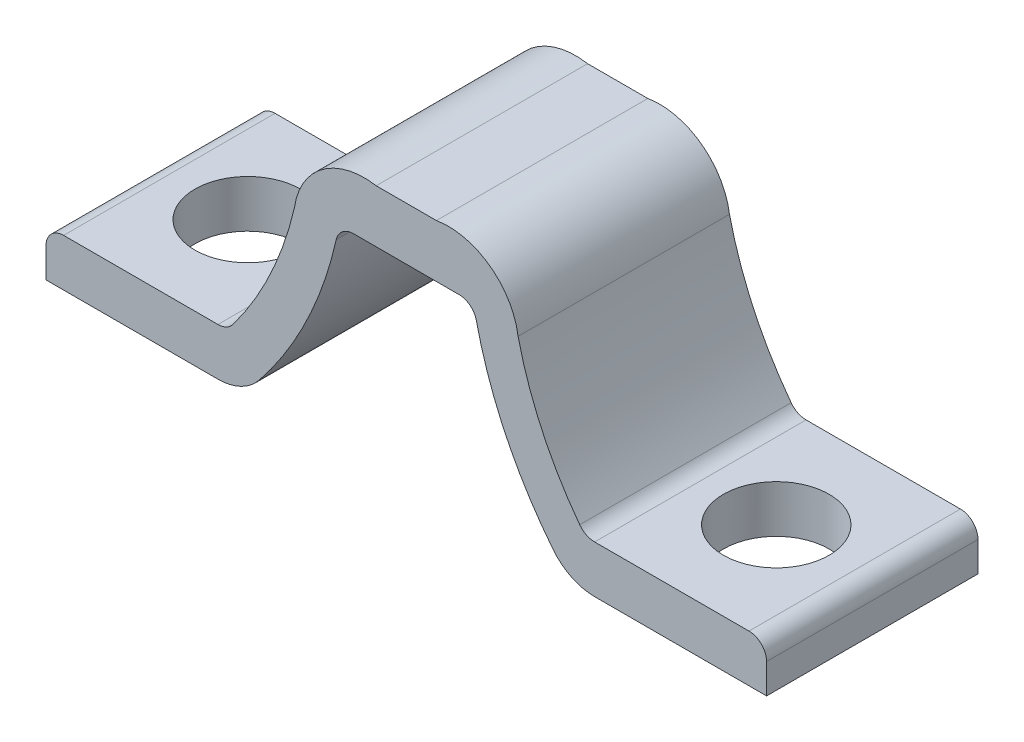
ISO-10303-21;
HEADER;
FILE_DESCRIPTION(('STEP AP214'),'2;1');
FILE_NAME('part.step','',(''),(''),'','','');
FILE_SCHEMA(('AUTOMOTIVE_DESIGN { 1 0 10303 214 1 1 1 1 }'));
ENDSEC;
DATA;
#1=APPLICATION_CONTEXT('core data for automotive mechanical design processes');
#2=APPLICATION_PROTOCOL_DEFINITION('international standard','automotive_design',2000,#1);
#3=PRODUCT_CONTEXT('',#1,'mechanical');
#4=PRODUCT('Part','Part','',(#3));
#5=PRODUCT_RELATED_PRODUCT_CATEGORY('part','',(#4));
#6=PRODUCT_DEFINITION_FORMATION('','',#4);
#7=PRODUCT_DEFINITION_CONTEXT('part definition',#1,'design');
#8=PRODUCT_DEFINITION('design','',#6,#7);
#9=PRODUCT_DEFINITION_SHAPE('','',#8);
#10=(LENGTH_UNIT() NAMED_UNIT(*) SI_UNIT(.MILLI.,.METRE.));
#11=(NAMED_UNIT(*) PLANE_ANGLE_UNIT() SI_UNIT($,.RADIAN.));
#12=(NAMED_UNIT(*) SI_UNIT($,.STERADIAN.) SOLID_ANGLE_UNIT());
#13=UNCERTAINTY_MEASURE_WITH_UNIT(LENGTH_MEASURE(1.E-05),#10,'distance_accuracy_value','');
#14=(GEOMETRIC_REPRESENTATION_CONTEXT(3) GLOBAL_UNCERTAINTY_ASSIGNED_CONTEXT((#13)) GLOBAL_UNIT_ASSIGNED_CONTEXT((#10,
#11,#12)) REPRESENTATION_CONTEXT('',''));
#15=CARTESIAN_POINT('',(0.,0.,0.));
#16=DIRECTION('',(0.,0.,1.));
#17=DIRECTION('',(1.,0.,0.));
#18=AXIS2_PLACEMENT_3D('',#15,#16,#17);
#19=CARTESIAN_POINT('',(6.78866498730215,2.38113734804587,7.62));
#20=DIRECTION('',(0.,0.,-1.));
#21=DIRECTION('',(-1.,0.,0.));
#22=AXIS2_PLACEMENT_3D('',#19,#20,#21);
#23=CYLINDRICAL_SURFACE('',#22,0.67297468040052);
#24=CARTESIAN_POINT('',(6.78866498730215,2.38113734804587,0.));
#25=DIRECTION('',(0.,0.,1.));
#26=DIRECTION('',(1.,0.,0.));
#27=AXIS2_PLACEMENT_3D('',#24,#25,#26);
#28=CIRCLE('',#27,0.67297468040052);
#29=CARTESIAN_POINT('',(6.78866498730215,1.70816266764535,0.));
#30=VERTEX_POINT('',#29);
#31=CARTESIAN_POINT('',(6.25072189397713,1.97677099335735,0.));
#32=VERTEX_POINT('',#31);
#33=EDGE_CURVE('E216',#30,#32,#28,.F.);
#34=ORIENTED_EDGE('',*,*,#33,.T.);
#35=DIRECTION('',(0.,0.,-1.));
#36=VECTOR('',#35,1.);
#37=CARTESIAN_POINT('',(6.25072189397713,1.97677099335735,7.62));
#38=LINE('',#37,#36);
#39=CARTESIAN_POINT('',(6.25072189397713,1.97677099335735,7.62));
#40=VERTEX_POINT('',#39);
#41=EDGE_CURVE('E11',#40,#32,#38,.T.);
#42=ORIENTED_EDGE('',*,*,#41,.F.);
#43=CARTESIAN_POINT('',(6.78866498730215,2.38113734804587,7.62));
#44=DIRECTION('',(0.,0.,1.));
#45=DIRECTION('',(1.,0.,0.));
#46=AXIS2_PLACEMENT_3D('',#43,#44,#45);
#47=CIRCLE('',#46,0.67297468040052);
#48=CARTESIAN_POINT('',(6.78866498730215,1.70816266764535,7.62));
#49=VERTEX_POINT('',#48);
#50=EDGE_CURVE('E274',#49,#40,#47,.F.);
#51=ORIENTED_EDGE('',*,*,#50,.F.);
#52=DIRECTION('',(0.,0.,-1.));
#53=VECTOR('',#52,1.);
#54=CARTESIAN_POINT('',(6.78866498730215,1.70816266764535,7.62));
#55=LINE('',#54,#53);
#56=EDGE_CURVE('E212',#49,#30,#55,.T.);
#57=ORIENTED_EDGE('',*,*,#56,.T.);
#58=EDGE_LOOP('',(#34,#42,#51,#57));
#59=FACE_BOUND('',#58,.T.);
#60=ADVANCED_FACE('F35',(#59),#23,.F.);
#61=CARTESIAN_POINT('',(16.4024816617619,9.60774561113634,7.62));
#62=DIRECTION('',(0.,0.,-1.));
#63=DIRECTION('',(-1.,0.,0.));
#64=AXIS2_PLACEMENT_3D('',#61,#62,#63);
#65=CYLINDRICAL_SURFACE('',#64,12.7);
#66=CARTESIAN_POINT('',(16.4024816617619,9.60774561113634,0.));
#67=DIRECTION('',(0.,0.,1.));
#68=DIRECTION('',(1.,0.,0.));
#69=AXIS2_PLACEMENT_3D('',#66,#67,#68);
#70=CIRCLE('',#69,12.7);
#71=CARTESIAN_POINT('',(4.02932646457833,6.74504924819284,0.));
#72=VERTEX_POINT('',#71);
#73=EDGE_CURVE('E219',#32,#72,#70,.F.);
#74=ORIENTED_EDGE('',*,*,#73,.T.);
#75=DIRECTION('',(0.,0.,-1.));
#76=VECTOR('',#75,1.);
#77=CARTESIAN_POINT('',(4.02932646457833,6.74504924819284,7.62));
#78=LINE('',#77,#76);
#79=CARTESIAN_POINT('',(4.02932646457833,6.74504924819284,7.62));
#80=VERTEX_POINT('',#79);
#81=EDGE_CURVE('E44',#80,#72,#78,.T.);
#82=ORIENTED_EDGE('',*,*,#81,.F.);
#83=CARTESIAN_POINT('',(16.4024816617619,9.60774561113634,7.62));
#84=DIRECTION('',(0.,0.,1.));
#85=DIRECTION('',(1.,0.,0.));
#86=AXIS2_PLACEMENT_3D('',#83,#84,#85);
#87=CIRCLE('',#86,12.7);
#88=EDGE_CURVE('E137',#40,#80,#87,.F.);
#89=ORIENTED_EDGE('',*,*,#88,.F.);
#90=ORIENTED_EDGE('',*,*,#41,.T.);
#91=EDGE_LOOP('',(#74,#82,#89,#90));
#92=FACE_BOUND('',#91,.T.);
#93=ADVANCED_FACE('F318',(#92),#65,.F.);
#94=CARTESIAN_POINT('',(1.5147536769133,6.38654723211135,7.62));
#95=DIRECTION('',(0.,0.,-1.));
#96=DIRECTION('',(-1.,0.,0.));
#97=AXIS2_PLACEMENT_3D('',#94,#95,#96);
#98=CYLINDRICAL_SURFACE('',#97,2.54);
#99=CARTESIAN_POINT('',(1.5147536769133,6.38654723211135,0.));
#100=DIRECTION('',(0.,0.,1.));
#101=DIRECTION('',(1.,0.,0.));
#102=AXIS2_PLACEMENT_3D('',#99,#100,#101);
#103=CIRCLE('',#102,2.54);
#104=CARTESIAN_POINT('',(1.08542368850035,8.89,0.));
#105=VERTEX_POINT('',#104);
#106=EDGE_CURVE('E222',#105,#72,#103,.F.);
#107=ORIENTED_EDGE('',*,*,#106,.F.);
#108=DIRECTION('',(0.,0.,-1.));
#109=VECTOR('',#108,1.);
#110=CARTESIAN_POINT('',(1.08542368850035,8.89,7.62));
#111=LINE('',#110,#109);
#112=CARTESIAN_POINT('',(1.08542368850035,8.89,7.62));
#113=VERTEX_POINT('',#112);
#114=EDGE_CURVE('E310',#113,#105,#111,.T.);
#115=ORIENTED_EDGE('',*,*,#114,.F.);
#116=CARTESIAN_POINT('',(1.5147536769133,6.38654723211135,7.62));
#117=DIRECTION('',(0.,0.,1.));
#118=DIRECTION('',(1.,0.,0.));
#119=AXIS2_PLACEMENT_3D('',#116,#117,#118);
#120=CIRCLE('',#119,2.54);
#121=EDGE_CURVE('E317',#113,#80,#120,.F.);
#122=ORIENTED_EDGE('',*,*,#121,.T.);
#123=ORIENTED_EDGE('',*,*,#81,.T.);
#124=EDGE_LOOP('',(#107,#115,#122,#123));
#125=FACE_BOUND('',#124,.T.);
#126=ADVANCED_FACE('F315',(#125),#98,.T.);
#127=CARTESIAN_POINT('',(0.,8.89,7.62));
#128=DIRECTION('',(0.,1.,0.));
#129=DIRECTION('',(0.,0.,1.));
#130=AXIS2_PLACEMENT_3D('',#127,#128,#129);
#131=PLANE('',#130);
#132=DIRECTION('',(1.,0.,0.));
#133=VECTOR('',#132,1.);
#134=CARTESIAN_POINT('',(0.,8.89,0.));
#135=LINE('',#134,#133);
#136=CARTESIAN_POINT('',(-1.08542368850035,8.89,0.));
#137=VERTEX_POINT('',#136);
#138=EDGE_CURVE('E225',#137,#105,#135,.T.);
#139=ORIENTED_EDGE('',*,*,#138,.F.);
#140=DIRECTION('',(0.,0.,-1.));
#141=VECTOR('',#140,1.);
#142=CARTESIAN_POINT('',(-1.08542368850035,8.89,7.62));
#143=LINE('',#142,#141);
#144=CARTESIAN_POINT('',(-1.08542368850035,8.89,7.62));
#145=VERTEX_POINT('',#144);
#146=EDGE_CURVE('E308',#145,#137,#143,.T.);
#147=ORIENTED_EDGE('',*,*,#146,.F.);
#148=DIRECTION('',(1.,0.,0.));
#149=VECTOR('',#148,1.);
#150=CARTESIAN_POINT('',(0.,8.89,7.62));
#151=LINE('',#150,#149);
#152=EDGE_CURVE('E330',#145,#113,#151,.T.);
#153=ORIENTED_EDGE('',*,*,#152,.T.);
#154=ORIENTED_EDGE('',*,*,#114,.T.);
#155=EDGE_LOOP('',(#139,#147,#153,#154));
#156=FACE_BOUND('',#155,.T.);
#157=ADVANCED_FACE('F326',(#156),#131,.T.);
#158=CARTESIAN_POINT('',(-1.5147536769133,6.38654723211135,7.62));
#159=DIRECTION('',(0.,0.,-1.));
#160=DIRECTION('',(-1.,0.,0.));
#161=AXIS2_PLACEMENT_3D('',#158,#159,#160);
#162=CYLINDRICAL_SURFACE('',#161,2.54);
#163=CARTESIAN_POINT('',(-1.5147536769133,6.38654723211135,0.));
#164=DIRECTION('',(0.,0.,1.));
#165=DIRECTION('',(1.,0.,0.));
#166=AXIS2_PLACEMENT_3D('',#163,#164,#165);
#167=CIRCLE('',#166,2.54);
#168=CARTESIAN_POINT('',(-4.02932646457833,6.74504924819284,0.));
#169=VERTEX_POINT('',#168);
#170=EDGE_CURVE('E228',#137,#169,#167,.T.);
#171=ORIENTED_EDGE('',*,*,#170,.T.);
#172=DIRECTION('',(0.,0.,-1.));
#173=VECTOR('',#172,1.);
#174=CARTESIAN_POINT('',(-4.02932646457833,6.74504924819284,7.62));
#175=LINE('',#174,#173);
#176=CARTESIAN_POINT('',(-4.02932646457833,6.74504924819284,7.62));
#177=VERTEX_POINT('',#176);
#178=EDGE_CURVE('E306',#177,#169,#175,.T.);
#179=ORIENTED_EDGE('',*,*,#178,.F.);
#180=CARTESIAN_POINT('',(-1.5147536769133,6.38654723211135,7.62));
#181=DIRECTION('',(0.,0.,1.));
#182=DIRECTION('',(1.,0.,0.));
#183=AXIS2_PLACEMENT_3D('',#180,#181,#182);
#184=CIRCLE('',#183,2.54);
#185=EDGE_CURVE('E332',#145,#177,#184,.T.);
#186=ORIENTED_EDGE('',*,*,#185,.F.);
#187=ORIENTED_EDGE('',*,*,#146,.T.);
#188=EDGE_LOOP('',(#171,#179,#186,#187));
#189=FACE_BOUND('',#188,.T.);
#190=ADVANCED_FACE('F401',(#189),#162,.T.);
#191=CARTESIAN_POINT('',(-16.4024816617619,9.60774561113634,7.62));
#192=DIRECTION('',(0.,0.,-1.));
#193=DIRECTION('',(-1.,0.,0.));
#194=AXIS2_PLACEMENT_3D('',#191,#192,#193);
#195=CYLINDRICAL_SURFACE('',#194,12.7);
#196=CARTESIAN_POINT('',(-16.4024816617619,9.60774561113634,0.));
#197=DIRECTION('',(0.,0.,1.));
#198=DIRECTION('',(1.,0.,0.));
#199=AXIS2_PLACEMENT_3D('',#196,#197,#198);
#200=CIRCLE('',#199,12.7);
#201=CARTESIAN_POINT('',(-6.25072189397713,1.97677099335735,0.));
#202=VERTEX_POINT('',#201);
#203=EDGE_CURVE('E231',#202,#169,#200,.T.);
#204=ORIENTED_EDGE('',*,*,#203,.F.);
#205=DIRECTION('',(0.,0.,-1.));
#206=VECTOR('',#205,1.);
#207=CARTESIAN_POINT('',(-6.25072189397713,1.97677099335735,7.62));
#208=LINE('',#207,#206);
#209=CARTESIAN_POINT('',(-6.25072189397713,1.97677099335735,7.62));
#210=VERTEX_POINT('',#209);
#211=EDGE_CURVE('E304',#210,#202,#208,.T.);
#212=ORIENTED_EDGE('',*,*,#211,.F.);
#213=CARTESIAN_POINT('',(-16.4024816617619,9.60774561113634,7.62));
#214=DIRECTION('',(0.,0.,1.));
#215=DIRECTION('',(1.,0.,0.));
#216=AXIS2_PLACEMENT_3D('',#213,#214,#215);
#217=CIRCLE('',#216,12.7);
#218=EDGE_CURVE('E338',#210,#177,#217,.T.);
#219=ORIENTED_EDGE('',*,*,#218,.T.);
#220=ORIENTED_EDGE('',*,*,#178,.T.);
#221=EDGE_LOOP('',(#204,#212,#219,#220));
#222=FACE_BOUND('',#221,.T.);
#223=ADVANCED_FACE('F404',(#222),#195,.F.);
#224=CARTESIAN_POINT('',(-6.78866498730215,2.38113734804587,7.62));
#225=DIRECTION('',(0.,0.,-1.));
#226=DIRECTION('',(-1.,0.,0.));
#227=AXIS2_PLACEMENT_3D('',#224,#225,#226);
#228=CYLINDRICAL_SURFACE('',#227,0.67297468040052);
#229=CARTESIAN_POINT('',(-6.78866498730215,2.38113734804587,0.));
#230=DIRECTION('',(0.,0.,1.));
#231=DIRECTION('',(1.,0.,0.));
#232=AXIS2_PLACEMENT_3D('',#229,#230,#231);
#233=CIRCLE('',#232,0.67297468040052);
#234=CARTESIAN_POINT('',(-6.78866498730215,1.70816266764535,0.));
#235=VERTEX_POINT('',#234);
#236=EDGE_CURVE('E234',#235,#202,#233,.T.);
#237=ORIENTED_EDGE('',*,*,#236,.F.);
#238=DIRECTION('',(0.,0.,-1.));
#239=VECTOR('',#238,1.);
#240=CARTESIAN_POINT('',(-6.78866498730215,1.70816266764535,7.62));
#241=LINE('',#240,#239);
#242=CARTESIAN_POINT('',(-6.78866498730215,1.70816266764535,7.62));
#243=VERTEX_POINT('',#242);
#244=EDGE_CURVE('E302',#243,#235,#241,.T.);
#245=ORIENTED_EDGE('',*,*,#244,.F.);
#246=CARTESIAN_POINT('',(-6.78866498730215,2.38113734804587,7.62));
#247=DIRECTION('',(0.,0.,1.));
#248=DIRECTION('',(1.,0.,0.));
#249=AXIS2_PLACEMENT_3D('',#246,#247,#248);
#250=CIRCLE('',#249,0.67297468040052);
#251=EDGE_CURVE('E341',#243,#210,#250,.T.);
#252=ORIENTED_EDGE('',*,*,#251,.T.);
#253=ORIENTED_EDGE('',*,*,#211,.T.);
#254=EDGE_LOOP('',(#237,#245,#252,#253));
#255=FACE_BOUND('',#254,.T.);
#256=ADVANCED_FACE('F408',(#255),#228,.F.);
#257=CARTESIAN_POINT('',(0.,1.70816266764535,7.62));
#258=DIRECTION('',(0.,1.,0.));
#259=DIRECTION('',(0.,0.,1.));
#260=AXIS2_PLACEMENT_3D('',#257,#258,#259);
#261=PLANE('',#260);
#262=CARTESIAN_POINT('',(-9.525,1.70816266764535,3.81));
#263=DIRECTION('',(0.,1.,0.));
#264=DIRECTION('',(0.,0.,1.));
#265=AXIS2_PLACEMENT_3D('',#262,#263,#264);
#266=CIRCLE('',#265,1.905);
#267=CARTESIAN_POINT('',(-9.525,1.70816266764535,5.715));
#268=VERTEX_POINT('',#267);
#269=EDGE_CURVE('E539',#268,#268,#266,.T.);
#270=ORIENTED_EDGE('',*,*,#269,.F.);
#271=EDGE_LOOP('',(#270));
#272=FACE_BOUND('',#271,.T.);
#273=DIRECTION('',(1.,0.,0.));
#274=VECTOR('',#273,1.);
#275=CARTESIAN_POINT('',(0.,1.70816266764535,0.));
#276=LINE('',#275,#274);
#277=CARTESIAN_POINT('',(-12.3509367165086,1.70816266764535,0.));
#278=VERTEX_POINT('',#277);
#279=EDGE_CURVE('E237',#278,#235,#276,.T.);
#280=ORIENTED_EDGE('',*,*,#279,.F.);
#281=DIRECTION('',(0.,0.,-1.));
#282=VECTOR('',#281,1.);
#283=CARTESIAN_POINT('',(-12.3509367165086,1.70816266764535,7.62));
#284=LINE('',#283,#282);
#285=CARTESIAN_POINT('',(-12.3509367165086,1.70816266764535,7.62));
#286=VERTEX_POINT('',#285);
#287=EDGE_CURVE('E300',#286,#278,#284,.T.);
#288=ORIENTED_EDGE('',*,*,#287,.F.);
#289=DIRECTION('',(1.,0.,0.));
#290=VECTOR('',#289,1.);
#291=CARTESIAN_POINT('',(0.,1.70816266764535,7.62));
#292=LINE('',#291,#290);
#293=EDGE_CURVE('E344',#286,#243,#292,.T.);
#294=ORIENTED_EDGE('',*,*,#293,.T.);
#295=ORIENTED_EDGE('',*,*,#244,.T.);
#296=EDGE_LOOP('',(#280,#288,#294,#295));
#297=FACE_BOUND('',#296,.T.);
#298=ADVANCED_FACE('F412',(#272,#297),#261,.T.);
#299=CARTESIAN_POINT('',(-12.3509367165086,1.07316266764535,7.62));
#300=DIRECTION('',(0.,0.,-1.));
#301=DIRECTION('',(-1.,0.,0.));
#302=AXIS2_PLACEMENT_3D('',#299,#300,#301);
#303=CYLINDRICAL_SURFACE('',#302,0.635);
#304=CARTESIAN_POINT('',(-12.3509367165086,1.07316266764535,0.));
#305=DIRECTION('',(0.,0.,1.));
#306=DIRECTION('',(1.,0.,0.));
#307=AXIS2_PLACEMENT_3D('',#304,#305,#306);
#308=CIRCLE('',#307,0.635);
#309=CARTESIAN_POINT('',(-12.9859367165086,1.07316266764535,0.));
#310=VERTEX_POINT('',#309);
#311=EDGE_CURVE('E240',#310,#278,#308,.F.);
#312=ORIENTED_EDGE('',*,*,#311,.F.);
#313=DIRECTION('',(0.,0.,-1.));
#314=VECTOR('',#313,1.);
#315=CARTESIAN_POINT('',(-12.9859367165086,1.07316266764535,7.62));
#316=LINE('',#315,#314);
#317=CARTESIAN_POINT('',(-12.9859367165086,1.07316266764535,7.62));
#318=VERTEX_POINT('',#317);
#319=EDGE_CURVE('E298',#318,#310,#316,.T.);
#320=ORIENTED_EDGE('',*,*,#319,.F.);
#321=CARTESIAN_POINT('',(-12.3509367165086,1.07316266764535,7.62));
#322=DIRECTION('',(0.,0.,1.));
#323=DIRECTION('',(1.,0.,0.));
#324=AXIS2_PLACEMENT_3D('',#321,#322,#323);
#325=CIRCLE('',#324,0.635);
#326=EDGE_CURVE('E347',#318,#286,#325,.F.);
#327=ORIENTED_EDGE('',*,*,#326,.T.);
#328=ORIENTED_EDGE('',*,*,#287,.T.);
#329=EDGE_LOOP('',(#312,#320,#327,#328));
#330=FACE_BOUND('',#329,.T.);
#331=ADVANCED_FACE('F416',(#330),#303,.T.);
#332=CARTESIAN_POINT('',(-12.9859367165086,0.,7.62));
#333=DIRECTION('',(-1.,0.,0.));
#334=DIRECTION('',(0.,0.,1.));
#335=AXIS2_PLACEMENT_3D('',#332,#333,#334);
#336=PLANE('',#335);
#337=DIRECTION('',(0.,1.,0.));
#338=VECTOR('',#337,1.);
#339=CARTESIAN_POINT('',(-12.9859367165086,0.,0.));
#340=LINE('',#339,#338);
#341=CARTESIAN_POINT('',(-12.9859367165086,0.,0.));
#342=VERTEX_POINT('',#341);
#343=EDGE_CURVE('E243',#342,#310,#340,.T.);
#344=ORIENTED_EDGE('',*,*,#343,.F.);
#345=DIRECTION('',(0.,0.,-1.));
#346=VECTOR('',#345,1.);
#347=CARTESIAN_POINT('',(-12.9859367165086,0.,7.62));
#348=LINE('',#347,#346);
#349=CARTESIAN_POINT('',(-12.9859367165086,0.,7.62));
#350=VERTEX_POINT('',#349);
#351=EDGE_CURVE('E296',#350,#342,#348,.T.);
#352=ORIENTED_EDGE('',*,*,#351,.F.);
#353=DIRECTION('',(0.,1.,0.));
#354=VECTOR('',#353,1.);
#355=CARTESIAN_POINT('',(-12.9859367165086,0.,7.62));
#356=LINE('',#355,#354);
#357=EDGE_CURVE('E350',#350,#318,#356,.T.);
#358=ORIENTED_EDGE('',*,*,#357,.T.);
#359=ORIENTED_EDGE('',*,*,#319,.T.);
#360=EDGE_LOOP('',(#344,#352,#358,#359));
#361=FACE_BOUND('',#360,.T.);
#362=ADVANCED_FACE('F420',(#361),#336,.T.);
#363=CARTESIAN_POINT('',(0.,0.,7.62));
#364=DIRECTION('',(0.,1.,0.));
#365=DIRECTION('',(0.,0.,1.));
#366=AXIS2_PLACEMENT_3D('',#363,#364,#365);
#367=PLANE('',#366);
#368=CARTESIAN_POINT('',(-9.525,0.,3.81));
#369=DIRECTION('',(0.,1.,0.));
#370=DIRECTION('',(0.,0.,1.));
#371=AXIS2_PLACEMENT_3D('',#368,#369,#370);
#372=CIRCLE('',#371,1.905);
#373=CARTESIAN_POINT('',(-9.525,0.,5.715));
#374=VERTEX_POINT('',#373);
#375=EDGE_CURVE('E38',#374,#374,#372,.T.);
#376=ORIENTED_EDGE('',*,*,#375,.T.);
#377=EDGE_LOOP('',(#376));
#378=FACE_BOUND('',#377,.T.);
#379=DIRECTION('',(1.,0.,0.));
#380=VECTOR('',#379,1.);
#381=CARTESIAN_POINT('',(0.,0.,0.));
#382=LINE('',#381,#380);
#383=CARTESIAN_POINT('',(-6.78866498730215,0.,0.));
#384=VERTEX_POINT('',#383);
#385=EDGE_CURVE('E246',#342,#384,#382,.T.);
#386=ORIENTED_EDGE('',*,*,#385,.T.);
#387=DIRECTION('',(0.,0.,-1.));
#388=VECTOR('',#387,1.);
#389=CARTESIAN_POINT('',(-6.78866498730215,0.,7.62));
#390=LINE('',#389,#388);
#391=CARTESIAN_POINT('',(-6.78866498730215,0.,7.62));
#392=VERTEX_POINT('',#391);
#393=EDGE_CURVE('E293',#392,#384,#390,.T.);
#394=ORIENTED_EDGE('',*,*,#393,.F.);
#395=DIRECTION('',(1.,0.,0.));
#396=VECTOR('',#395,1.);
#397=CARTESIAN_POINT('',(0.,0.,7.62));
#398=LINE('',#397,#396);
#399=EDGE_CURVE('E353',#350,#392,#398,.T.);
#400=ORIENTED_EDGE('',*,*,#399,.F.);
#401=ORIENTED_EDGE('',*,*,#351,.T.);
#402=EDGE_LOOP('',(#386,#394,#400,#401));
#403=FACE_BOUND('',#402,.T.);
#404=ADVANCED_FACE('F424',(#378,#403),#367,.F.);
#405=CARTESIAN_POINT('',(-6.78866498730215,1.905,7.62));
#406=DIRECTION('',(0.,0.,-1.));
#407=DIRECTION('',(-1.,0.,0.));
#408=AXIS2_PLACEMENT_3D('',#405,#406,#407);
#409=CYLINDRICAL_SURFACE('',#408,1.905);
#410=CARTESIAN_POINT('',(-6.78866498730215,1.905,0.));
#411=DIRECTION('',(0.,0.,1.));
#412=DIRECTION('',(1.,0.,0.));
#413=AXIS2_PLACEMENT_3D('',#410,#411,#412);
#414=CIRCLE('',#413,1.905);
#415=CARTESIAN_POINT('',(-5.30199230568466,0.713853771473764,0.));
#416=VERTEX_POINT('',#415);
#417=EDGE_CURVE('E248',#384,#416,#414,.T.);
#418=ORIENTED_EDGE('',*,*,#417,.T.);
#419=DIRECTION('',(0.,0.,-1.));
#420=VECTOR('',#419,1.);
#421=CARTESIAN_POINT('',(-5.30199230568466,0.713853771473764,7.62));
#422=LINE('',#421,#420);
#423=CARTESIAN_POINT('',(-5.30199230568466,0.713853771473764,7.62));
#424=VERTEX_POINT('',#423);
#425=EDGE_CURVE('E290',#424,#416,#422,.T.);
#426=ORIENTED_EDGE('',*,*,#425,.F.);
#427=CARTESIAN_POINT('',(-6.78866498730215,1.905,7.62));
#428=DIRECTION('',(0.,0.,1.));
#429=DIRECTION('',(1.,0.,0.));
#430=AXIS2_PLACEMENT_3D('',#427,#428,#429);
#431=CIRCLE('',#430,1.905);
#432=EDGE_CURVE('E355',#392,#424,#431,.T.);
#433=ORIENTED_EDGE('',*,*,#432,.F.);
#434=ORIENTED_EDGE('',*,*,#393,.T.);
#435=EDGE_LOOP('',(#418,#426,#433,#434));
#436=FACE_BOUND('',#435,.T.);
#437=ADVANCED_FACE('F428',(#436),#409,.T.);
#438=CARTESIAN_POINT('',(-16.4024816617619,9.60774561113634,7.62));
#439=DIRECTION('',(0.,0.,-1.));
#440=DIRECTION('',(-1.,0.,0.));
#441=AXIS2_PLACEMENT_3D('',#438,#439,#440);
#442=CYLINDRICAL_SURFACE('',#441,14.224);
#443=CARTESIAN_POINT('',(-16.4024816617619,9.60774561113634,0.));
#444=DIRECTION('',(0.,0.,1.));
#445=DIRECTION('',(1.,0.,0.));
#446=AXIS2_PLACEMENT_3D('',#443,#444,#445);
#447=CIRCLE('',#446,14.224);
#448=CARTESIAN_POINT('',(-2.52455049836589,6.48921989791181,0.));
#449=VERTEX_POINT('',#448);
#450=EDGE_CURVE('E250',#416,#449,#447,.T.);
#451=ORIENTED_EDGE('',*,*,#450,.T.);
#452=DIRECTION('',(0.,0.,-1.));
#453=VECTOR('',#452,1.);
#454=CARTESIAN_POINT('',(-2.52455049836589,6.48921989791181,7.62));
#455=LINE('',#454,#453);
#456=CARTESIAN_POINT('',(-2.52455049836589,6.48921989791181,7.62));
#457=VERTEX_POINT('',#456);
#458=EDGE_CURVE('E288',#457,#449,#455,.T.);
#459=ORIENTED_EDGE('',*,*,#458,.F.);
#460=CARTESIAN_POINT('',(-16.4024816617619,9.60774561113634,7.62));
#461=DIRECTION('',(0.,0.,1.));
#462=DIRECTION('',(1.,0.,0.));
#463=AXIS2_PLACEMENT_3D('',#460,#461,#462);
#464=CIRCLE('',#463,14.224);
#465=EDGE_CURVE('E357',#424,#457,#464,.T.);
#466=ORIENTED_EDGE('',*,*,#465,.F.);
#467=ORIENTED_EDGE('',*,*,#425,.T.);
#468=EDGE_LOOP('',(#451,#459,#466,#467));
#469=FACE_BOUND('',#468,.T.);
#470=ADVANCED_FACE('F432',(#469),#442,.T.);
#471=CARTESIAN_POINT('',(-1.905,6.35,7.62));
#472=DIRECTION('',(0.,0.,-1.));
#473=DIRECTION('',(-1.,0.,0.));
#474=AXIS2_PLACEMENT_3D('',#471,#472,#473);
#475=CYLINDRICAL_SURFACE('',#474,0.635);
#476=CARTESIAN_POINT('',(-1.905,6.35,0.));
#477=DIRECTION('',(0.,0.,1.));
#478=DIRECTION('',(1.,0.,0.));
#479=AXIS2_PLACEMENT_3D('',#476,#477,#478);
#480=CIRCLE('',#479,0.635);
#481=CARTESIAN_POINT('',(-1.905,6.985,0.));
#482=VERTEX_POINT('',#481);
#483=EDGE_CURVE('E253',#482,#449,#480,.T.);
#484=ORIENTED_EDGE('',*,*,#483,.F.);
#485=DIRECTION('',(0.,0.,-1.));
#486=VECTOR('',#485,1.);
#487=CARTESIAN_POINT('',(-1.905,6.985,7.62));
#488=LINE('',#487,#486);
#489=CARTESIAN_POINT('',(-1.905,6.985,7.62));
#490=VERTEX_POINT('',#489);
#491=EDGE_CURVE('E286',#490,#482,#488,.T.);
#492=ORIENTED_EDGE('',*,*,#491,.F.);
#493=CARTESIAN_POINT('',(-1.905,6.35,7.62));
#494=DIRECTION('',(0.,0.,1.));
#495=DIRECTION('',(1.,0.,0.));
#496=AXIS2_PLACEMENT_3D('',#493,#494,#495);
#497=CIRCLE('',#496,0.635);
#498=EDGE_CURVE('E359',#490,#457,#497,.T.);
#499=ORIENTED_EDGE('',*,*,#498,.T.);
#500=ORIENTED_EDGE('',*,*,#458,.T.);
#501=EDGE_LOOP('',(#484,#492,#499,#500));
#502=FACE_BOUND('',#501,.T.);
#503=ADVANCED_FACE('F436',(#502),#475,.F.);
#504=CARTESIAN_POINT('',(0.,6.985,7.62));
#505=DIRECTION('',(0.,-1.,0.));
#506=DIRECTION('',(0.,0.,-1.));
#507=AXIS2_PLACEMENT_3D('',#504,#505,#506);
#508=PLANE('',#507);
#509=DIRECTION('',(-1.,0.,0.));
#510=VECTOR('',#509,1.);
#511=CARTESIAN_POINT('',(0.,6.985,0.));
#512=LINE('',#511,#510);
#513=CARTESIAN_POINT('',(1.905,6.985,0.));
#514=VERTEX_POINT('',#513);
#515=EDGE_CURVE('E256',#514,#482,#512,.T.);
#516=ORIENTED_EDGE('',*,*,#515,.F.);
#517=DIRECTION('',(0.,0.,-1.));
#518=VECTOR('',#517,1.);
#519=CARTESIAN_POINT('',(1.905,6.985,7.62));
#520=LINE('',#519,#518);
#521=CARTESIAN_POINT('',(1.905,6.985,7.62));
#522=VERTEX_POINT('',#521);
#523=EDGE_CURVE('E284',#522,#514,#520,.T.);
#524=ORIENTED_EDGE('',*,*,#523,.F.);
#525=DIRECTION('',(-1.,0.,0.));
#526=VECTOR('',#525,1.);
#527=CARTESIAN_POINT('',(0.,6.985,7.62));
#528=LINE('',#527,#526);
#529=EDGE_CURVE('E362',#522,#490,#528,.T.);
#530=ORIENTED_EDGE('',*,*,#529,.T.);
#531=ORIENTED_EDGE('',*,*,#491,.T.);
#532=EDGE_LOOP('',(#516,#524,#530,#531));
#533=FACE_BOUND('',#532,.T.);
#534=ADVANCED_FACE('F440',(#533),#508,.T.);
#535=CARTESIAN_POINT('',(1.905,6.35,7.62));
#536=DIRECTION('',(0.,0.,-1.));
#537=DIRECTION('',(-1.,0.,0.));
#538=AXIS2_PLACEMENT_3D('',#535,#536,#537);
#539=CYLINDRICAL_SURFACE('',#538,0.635);
#540=CARTESIAN_POINT('',(1.905,6.35,0.));
#541=DIRECTION('',(0.,0.,1.));
#542=DIRECTION('',(1.,0.,0.));
#543=AXIS2_PLACEMENT_3D('',#540,#541,#542);
#544=CIRCLE('',#543,0.635);
#545=CARTESIAN_POINT('',(2.52455049836589,6.48921989791181,0.));
#546=VERTEX_POINT('',#545);
#547=EDGE_CURVE('E259',#514,#546,#544,.F.);
#548=ORIENTED_EDGE('',*,*,#547,.T.);
#549=DIRECTION('',(0.,0.,-1.));
#550=VECTOR('',#549,1.);
#551=CARTESIAN_POINT('',(2.52455049836589,6.48921989791181,7.62));
#552=LINE('',#551,#550);
#553=CARTESIAN_POINT('',(2.52455049836589,6.48921989791181,7.62));
#554=VERTEX_POINT('',#553);
#555=EDGE_CURVE('E282',#554,#546,#552,.T.);
#556=ORIENTED_EDGE('',*,*,#555,.F.);
#557=CARTESIAN_POINT('',(1.905,6.35,7.62));
#558=DIRECTION('',(0.,0.,1.));
#559=DIRECTION('',(1.,0.,0.));
#560=AXIS2_PLACEMENT_3D('',#557,#558,#559);
#561=CIRCLE('',#560,0.635);
#562=EDGE_CURVE('E365',#522,#554,#561,.F.);
#563=ORIENTED_EDGE('',*,*,#562,.F.);
#564=ORIENTED_EDGE('',*,*,#523,.T.);
#565=EDGE_LOOP('',(#548,#556,#563,#564));
#566=FACE_BOUND('',#565,.T.);
#567=ADVANCED_FACE('F444',(#566),#539,.F.);
#568=CARTESIAN_POINT('',(16.4024816617619,9.60774561113634,7.62));
#569=DIRECTION('',(0.,0.,-1.));
#570=DIRECTION('',(-1.,0.,0.));
#571=AXIS2_PLACEMENT_3D('',#568,#569,#570);
#572=CYLINDRICAL_SURFACE('',#571,14.224);
#573=CARTESIAN_POINT('',(16.4024816617619,9.60774561113634,0.));
#574=DIRECTION('',(0.,0.,1.));
#575=DIRECTION('',(1.,0.,0.));
#576=AXIS2_PLACEMENT_3D('',#573,#574,#575);
#577=CIRCLE('',#576,14.224);
#578=CARTESIAN_POINT('',(5.30199230568467,0.713853771473755,0.));
#579=VERTEX_POINT('',#578);
#580=EDGE_CURVE('E262',#579,#546,#577,.F.);
#581=ORIENTED_EDGE('',*,*,#580,.F.);
#582=DIRECTION('',(0.,0.,-1.));
#583=VECTOR('',#582,1.);
#584=CARTESIAN_POINT('',(5.30199230568467,0.713853771473755,7.62));
#585=LINE('',#584,#583);
#586=CARTESIAN_POINT('',(5.30199230568467,0.713853771473755,7.62));
#587=VERTEX_POINT('',#586);
#588=EDGE_CURVE('E280',#587,#579,#585,.T.);
#589=ORIENTED_EDGE('',*,*,#588,.F.);
#590=CARTESIAN_POINT('',(16.4024816617619,9.60774561113634,7.62));
#591=DIRECTION('',(0.,0.,1.));
#592=DIRECTION('',(1.,0.,0.));
#593=AXIS2_PLACEMENT_3D('',#590,#591,#592);
#594=CIRCLE('',#593,14.224);
#595=EDGE_CURVE('E367',#587,#554,#594,.F.);
#596=ORIENTED_EDGE('',*,*,#595,.T.);
#597=ORIENTED_EDGE('',*,*,#555,.T.);
#598=EDGE_LOOP('',(#581,#589,#596,#597));
#599=FACE_BOUND('',#598,.T.);
#600=ADVANCED_FACE('F448',(#599),#572,.T.);
#601=CARTESIAN_POINT('',(6.78866498730215,1.905,7.62));
#602=DIRECTION('',(0.,0.,-1.));
#603=DIRECTION('',(-1.,0.,0.));
#604=AXIS2_PLACEMENT_3D('',#601,#602,#603);
#605=CYLINDRICAL_SURFACE('',#604,1.905);
#606=CARTESIAN_POINT('',(6.78866498730215,1.905,0.));
#607=DIRECTION('',(0.,0.,1.));
#608=DIRECTION('',(1.,0.,0.));
#609=AXIS2_PLACEMENT_3D('',#606,#607,#608);
#610=CIRCLE('',#609,1.905);
#611=CARTESIAN_POINT('',(6.78866498730215,0.,0.));
#612=VERTEX_POINT('',#611);
#613=EDGE_CURVE('E265',#612,#579,#610,.F.);
#614=ORIENTED_EDGE('',*,*,#613,.F.);
#615=DIRECTION('',(0.,0.,-1.));
#616=VECTOR('',#615,1.);
#617=CARTESIAN_POINT('',(6.78866498730215,0.,7.62));
#618=LINE('',#617,#616);
#619=CARTESIAN_POINT('',(6.78866498730215,0.,7.62));
#620=VERTEX_POINT('',#619);
#621=EDGE_CURVE('E278',#620,#612,#618,.T.);
#622=ORIENTED_EDGE('',*,*,#621,.F.);
#623=CARTESIAN_POINT('',(6.78866498730215,1.905,7.62));
#624=DIRECTION('',(0.,0.,1.));
#625=DIRECTION('',(1.,0.,0.));
#626=AXIS2_PLACEMENT_3D('',#623,#624,#625);
#627=CIRCLE('',#626,1.905);
#628=EDGE_CURVE('E370',#620,#587,#627,.F.);
#629=ORIENTED_EDGE('',*,*,#628,.T.);
#630=ORIENTED_EDGE('',*,*,#588,.T.);
#631=EDGE_LOOP('',(#614,#622,#629,#630));
#632=FACE_BOUND('',#631,.T.);
#633=ADVANCED_FACE('F452',(#632),#605,.T.);
#634=CARTESIAN_POINT('',(0.,0.,7.62));
#635=DIRECTION('',(0.,-1.,0.));
#636=DIRECTION('',(0.,0.,-1.));
#637=AXIS2_PLACEMENT_3D('',#634,#635,#636);
#638=PLANE('',#637);
#639=CARTESIAN_POINT('',(9.525,0.,3.81));
#640=DIRECTION('',(0.,-1.,0.));
#641=DIRECTION('',(0.,0.,-1.));
#642=AXIS2_PLACEMENT_3D('',#639,#640,#641);
#643=CIRCLE('',#642,1.905);
#644=CARTESIAN_POINT('',(9.525,0.,1.905));
#645=VERTEX_POINT('',#644);
#646=EDGE_CURVE('E535',#645,#645,#643,.T.);
#647=ORIENTED_EDGE('',*,*,#646,.F.);
#648=EDGE_LOOP('',(#647));
#649=FACE_BOUND('',#648,.T.);
#650=DIRECTION('',(-1.,0.,0.));
#651=VECTOR('',#650,1.);
#652=CARTESIAN_POINT('',(0.,0.,0.));
#653=LINE('',#652,#651);
#654=CARTESIAN_POINT('',(12.9859367165086,0.,0.));
#655=VERTEX_POINT('',#654);
#656=EDGE_CURVE('E268',#655,#612,#653,.T.);
#657=ORIENTED_EDGE('',*,*,#656,.F.);
#658=DIRECTION('',(0.,0.,-1.));
#659=VECTOR('',#658,1.);
#660=CARTESIAN_POINT('',(12.9859367165086,0.,7.62));
#661=LINE('',#660,#659);
#662=CARTESIAN_POINT('',(12.9859367165086,0.,7.62));
#663=VERTEX_POINT('',#662);
#664=EDGE_CURVE('E207',#663,#655,#661,.T.);
#665=ORIENTED_EDGE('',*,*,#664,.F.);
#666=DIRECTION('',(-1.,0.,0.));
#667=VECTOR('',#666,1.);
#668=CARTESIAN_POINT('',(0.,0.,7.62));
#669=LINE('',#668,#667);
#670=EDGE_CURVE('E200',#663,#620,#669,.T.);
#671=ORIENTED_EDGE('',*,*,#670,.T.);
#672=ORIENTED_EDGE('',*,*,#621,.T.);
#673=EDGE_LOOP('',(#657,#665,#671,#672));
#674=FACE_BOUND('',#673,.T.);
#675=ADVANCED_FACE('F374',(#649,#674),#638,.T.);
#676=CARTESIAN_POINT('',(12.9859367165086,0.,7.62));
#677=DIRECTION('',(-1.,0.,0.));
#678=DIRECTION('',(0.,0.,1.));
#679=AXIS2_PLACEMENT_3D('',#676,#677,#678);
#680=PLANE('',#679);
#681=DIRECTION('',(0.,1.,0.));
#682=VECTOR('',#681,1.);
#683=CARTESIAN_POINT('',(12.9859367165086,0.,0.));
#684=LINE('',#683,#682);
#685=CARTESIAN_POINT('',(12.9859367165086,1.07316266764535,0.));
#686=VERTEX_POINT('',#685);
#687=EDGE_CURVE('E206',#655,#686,#684,.T.);
#688=ORIENTED_EDGE('',*,*,#687,.T.);
#689=DIRECTION('',(0.,0.,-1.));
#690=VECTOR('',#689,1.);
#691=CARTESIAN_POINT('',(12.9859367165086,1.07316266764535,7.62));
#692=LINE('',#691,#690);
#693=CARTESIAN_POINT('',(12.9859367165086,1.07316266764535,7.62));
#694=VERTEX_POINT('',#693);
#695=EDGE_CURVE('E203',#694,#686,#692,.T.);
#696=ORIENTED_EDGE('',*,*,#695,.F.);
#697=DIRECTION('',(0.,1.,0.));
#698=VECTOR('',#697,1.);
#699=CARTESIAN_POINT('',(12.9859367165086,0.,7.62));
#700=LINE('',#699,#698);
#701=EDGE_CURVE('E193',#663,#694,#700,.T.);
#702=ORIENTED_EDGE('',*,*,#701,.F.);
#703=ORIENTED_EDGE('',*,*,#664,.T.);
#704=EDGE_LOOP('',(#688,#696,#702,#703));
#705=FACE_BOUND('',#704,.T.);
#706=ADVANCED_FACE('F204',(#705),#680,.F.);
#707=CARTESIAN_POINT('',(12.3509367165086,1.07316266764535,7.62));
#708=DIRECTION('',(0.,0.,-1.));
#709=DIRECTION('',(-1.,0.,0.));
#710=AXIS2_PLACEMENT_3D('',#707,#708,#709);
#711=CYLINDRICAL_SURFACE('',#710,0.635);
#712=CARTESIAN_POINT('',(12.3509367165086,1.07316266764535,0.));
#713=DIRECTION('',(0.,0.,1.));
#714=DIRECTION('',(1.,0.,0.));
#715=AXIS2_PLACEMENT_3D('',#712,#713,#714);
#716=CIRCLE('',#715,0.635);
#717=CARTESIAN_POINT('',(12.3509367165086,1.70816266764535,0.));
#718=VERTEX_POINT('',#717);
#719=EDGE_CURVE('E123',#686,#718,#716,.T.);
#720=ORIENTED_EDGE('',*,*,#719,.T.);
#721=DIRECTION('',(0.,0.,-1.));
#722=VECTOR('',#721,1.);
#723=CARTESIAN_POINT('',(12.3509367165086,1.70816266764535,7.62));
#724=LINE('',#723,#722);
#725=CARTESIAN_POINT('',(12.3509367165086,1.70816266764535,7.62));
#726=VERTEX_POINT('',#725);
#727=EDGE_CURVE('E208',#726,#718,#724,.T.);
#728=ORIENTED_EDGE('',*,*,#727,.F.);
#729=CARTESIAN_POINT('',(12.3509367165086,1.07316266764535,7.62));
#730=DIRECTION('',(0.,0.,1.));
#731=DIRECTION('',(1.,0.,0.));
#732=AXIS2_PLACEMENT_3D('',#729,#730,#731);
#733=CIRCLE('',#732,0.635);
#734=EDGE_CURVE('E197',#694,#726,#733,.T.);
#735=ORIENTED_EDGE('',*,*,#734,.F.);
#736=ORIENTED_EDGE('',*,*,#695,.T.);
#737=EDGE_LOOP('',(#720,#728,#735,#736));
#738=FACE_BOUND('',#737,.T.);
#739=ADVANCED_FACE('F210',(#738),#711,.T.);
#740=CARTESIAN_POINT('',(0.,1.70816266764535,7.62));
#741=DIRECTION('',(0.,-1.,0.));
#742=DIRECTION('',(0.,0.,-1.));
#743=AXIS2_PLACEMENT_3D('',#740,#741,#742);
#744=PLANE('',#743);
#745=CARTESIAN_POINT('',(9.525,1.70816266764535,3.81));
#746=DIRECTION('',(0.,1.,0.));
#747=DIRECTION('',(0.,0.,1.));
#748=AXIS2_PLACEMENT_3D('',#745,#746,#747);
#749=CIRCLE('',#748,1.905);
#750=CARTESIAN_POINT('',(9.525,1.70816266764535,5.715));
#751=VERTEX_POINT('',#750);
#752=EDGE_CURVE('E537',#751,#751,#749,.T.);
#753=ORIENTED_EDGE('',*,*,#752,.F.);
#754=EDGE_LOOP('',(#753));
#755=FACE_BOUND('',#754,.T.);
#756=DIRECTION('',(-1.,0.,0.));
#757=VECTOR('',#756,1.);
#758=CARTESIAN_POINT('',(0.,1.70816266764535,0.));
#759=LINE('',#758,#757);
#760=EDGE_CURVE('E129',#718,#30,#759,.T.);
#761=ORIENTED_EDGE('',*,*,#760,.T.);
#762=ORIENTED_EDGE('',*,*,#56,.F.);
#763=DIRECTION('',(-1.,0.,0.));
#764=VECTOR('',#763,1.);
#765=CARTESIAN_POINT('',(0.,1.70816266764535,7.62));
#766=LINE('',#765,#764);
#767=EDGE_CURVE('E52',#726,#49,#766,.T.);
#768=ORIENTED_EDGE('',*,*,#767,.F.);
#769=ORIENTED_EDGE('',*,*,#727,.T.);
#770=EDGE_LOOP('',(#761,#762,#768,#769));
#771=FACE_BOUND('',#770,.T.);
#772=ADVANCED_FACE('F378',(#755,#771),#744,.F.);
#773=CARTESIAN_POINT('',(0.,0.,7.62));
#774=DIRECTION('',(0.,0.,1.));
#775=DIRECTION('',(1.,0.,0.));
#776=AXIS2_PLACEMENT_3D('',#773,#774,#775);
#777=PLANE('',#776);
#778=ORIENTED_EDGE('',*,*,#50,.T.);
#779=ORIENTED_EDGE('',*,*,#88,.T.);
#780=ORIENTED_EDGE('',*,*,#121,.F.);
#781=ORIENTED_EDGE('',*,*,#152,.F.);
#782=ORIENTED_EDGE('',*,*,#185,.T.);
#783=ORIENTED_EDGE('',*,*,#218,.F.);
#784=ORIENTED_EDGE('',*,*,#251,.F.);
#785=ORIENTED_EDGE('',*,*,#293,.F.);
#786=ORIENTED_EDGE('',*,*,#326,.F.);
#787=ORIENTED_EDGE('',*,*,#357,.F.);
#788=ORIENTED_EDGE('',*,*,#399,.T.);
#789=ORIENTED_EDGE('',*,*,#432,.T.);
#790=ORIENTED_EDGE('',*,*,#465,.T.);
#791=ORIENTED_EDGE('',*,*,#498,.F.);
#792=ORIENTED_EDGE('',*,*,#529,.F.);
#793=ORIENTED_EDGE('',*,*,#562,.T.);
#794=ORIENTED_EDGE('',*,*,#595,.F.);
#795=ORIENTED_EDGE('',*,*,#628,.F.);
#796=ORIENTED_EDGE('',*,*,#670,.F.);
#797=ORIENTED_EDGE('',*,*,#701,.T.);
#798=ORIENTED_EDGE('',*,*,#734,.T.);
#799=ORIENTED_EDGE('',*,*,#767,.T.);
#800=EDGE_LOOP('',(#778,#779,#780,#781,#782,#783,#784,#785,#786,#787,#788,#789,#790,#791,#792,
#793,#794,#795,#796,#797,#798,#799));
#801=FACE_BOUND('',#800,.T.);
#802=ADVANCED_FACE('F195',(#801),#777,.T.);
#803=CARTESIAN_POINT('',(0.,0.,0.));
#804=DIRECTION('',(0.,0.,1.));
#805=DIRECTION('',(1.,0.,0.));
#806=AXIS2_PLACEMENT_3D('',#803,#804,#805);
#807=PLANE('',#806);
#808=ORIENTED_EDGE('',*,*,#33,.F.);
#809=ORIENTED_EDGE('',*,*,#760,.F.);
#810=ORIENTED_EDGE('',*,*,#719,.F.);
#811=ORIENTED_EDGE('',*,*,#687,.F.);
#812=ORIENTED_EDGE('',*,*,#656,.T.);
#813=ORIENTED_EDGE('',*,*,#613,.T.);
#814=ORIENTED_EDGE('',*,*,#580,.T.);
#815=ORIENTED_EDGE('',*,*,#547,.F.);
#816=ORIENTED_EDGE('',*,*,#515,.T.);
#817=ORIENTED_EDGE('',*,*,#483,.T.);
#818=ORIENTED_EDGE('',*,*,#450,.F.);
#819=ORIENTED_EDGE('',*,*,#417,.F.);
#820=ORIENTED_EDGE('',*,*,#385,.F.);
#821=ORIENTED_EDGE('',*,*,#343,.T.);
#822=ORIENTED_EDGE('',*,*,#311,.T.);
#823=ORIENTED_EDGE('',*,*,#279,.T.);
#824=ORIENTED_EDGE('',*,*,#236,.T.);
#825=ORIENTED_EDGE('',*,*,#203,.T.);
#826=ORIENTED_EDGE('',*,*,#170,.F.);
#827=ORIENTED_EDGE('',*,*,#138,.T.);
#828=ORIENTED_EDGE('',*,*,#106,.T.);
#829=ORIENTED_EDGE('',*,*,#73,.F.);
#830=EDGE_LOOP('',(#808,#809,#810,#811,#812,#813,#814,#815,#816,#817,#818,#819,#820,#821,#822,
#823,#824,#825,#826,#827,#828,#829));
#831=FACE_BOUND('',#830,.T.);
#832=ADVANCED_FACE('F322',(#831),#807,.F.);
#833=CARTESIAN_POINT('',(-9.525,-3.37183733235465,3.81));
#834=DIRECTION('',(0.,1.,0.));
#835=DIRECTION('',(0.,0.,1.));
#836=AXIS2_PLACEMENT_3D('',#833,#834,#835);
#837=CYLINDRICAL_SURFACE('',#836,1.905);
#838=ORIENTED_EDGE('',*,*,#269,.T.);
#839=EDGE_LOOP('',(#838));
#840=FACE_BOUND('',#839,.T.);
#841=ORIENTED_EDGE('',*,*,#375,.F.);
#842=EDGE_LOOP('',(#841));
#843=FACE_BOUND('',#842,.T.);
#844=ADVANCED_FACE('F486',(#840,#843),#837,.F.);
#845=CARTESIAN_POINT('',(9.525,-3.37183733235465,3.81));
#846=DIRECTION('',(0.,1.,0.));
#847=DIRECTION('',(0.,0.,1.));
#848=AXIS2_PLACEMENT_3D('',#845,#846,#847);
#849=CYLINDRICAL_SURFACE('',#848,1.905);
#850=ORIENTED_EDGE('',*,*,#646,.T.);
#851=EDGE_LOOP('',(#850));
#852=FACE_BOUND('',#851,.T.);
#853=ORIENTED_EDGE('',*,*,#752,.T.);
#854=EDGE_LOOP('',(#853));
#855=FACE_BOUND('',#854,.T.);
#856=ADVANCED_FACE('F518',(#852,#855),#849,.F.);
#857=CLOSED_SHELL('',(#60,#93,#126,#157,#190,#223,#256,#298,#331,#362,#404,#437,#470,#503,#534,
#567,#600,#633,#675,#706,#739,#772,#802,#832,#844,#856));
#858=MANIFOLD_SOLID_BREP('B2',#857);
#859=ADVANCED_BREP_SHAPE_REPRESENTATION('',(#18,#858),#14);
#860=SHAPE_DEFINITION_REPRESENTATION(#9,#859);
ENDSEC;
END-ISO-10303-21;
